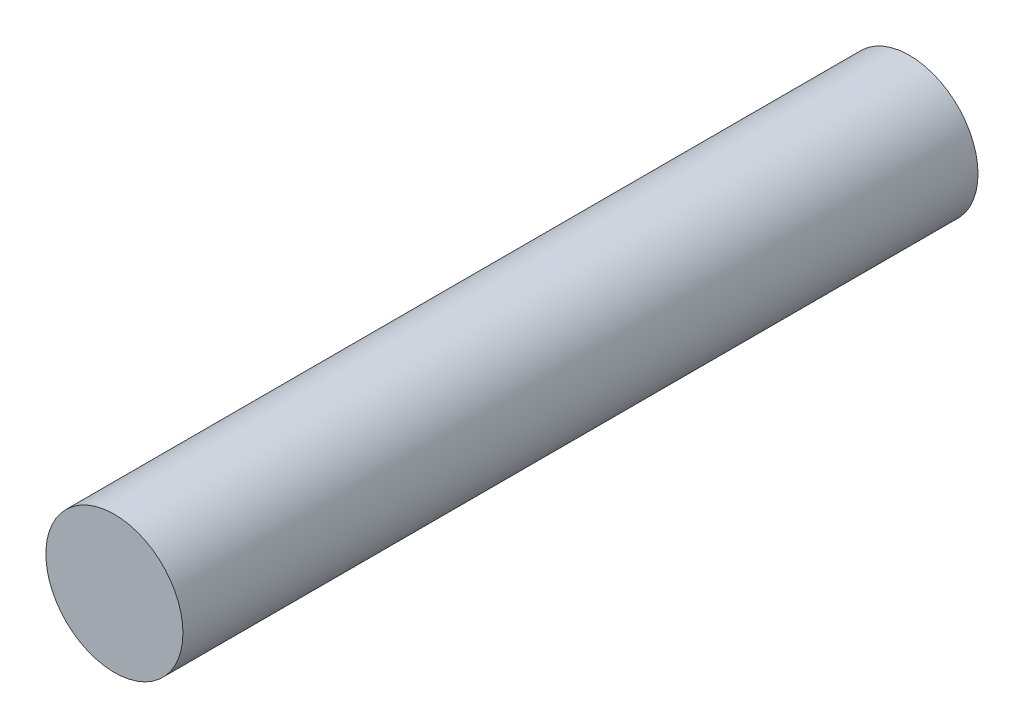
ISO-10303-21;
HEADER;
FILE_DESCRIPTION(('STEP AP214'),'2;1');
FILE_NAME('part.step','',(''),(''),'','','');
FILE_SCHEMA(('AUTOMOTIVE_DESIGN { 1 0 10303 214 1 1 1 1 }'));
ENDSEC;
DATA;
#1=APPLICATION_CONTEXT('core data for automotive mechanical design processes');
#2=APPLICATION_PROTOCOL_DEFINITION('international standard','automotive_design',2000,#1);
#3=PRODUCT_CONTEXT('',#1,'mechanical');
#4=PRODUCT('Part','Part','',(#3));
#5=PRODUCT_RELATED_PRODUCT_CATEGORY('part','',(#4));
#6=PRODUCT_DEFINITION_FORMATION('','',#4);
#7=PRODUCT_DEFINITION_CONTEXT('part definition',#1,'design');
#8=PRODUCT_DEFINITION('design','',#6,#7);
#9=PRODUCT_DEFINITION_SHAPE('','',#8);
#10=(LENGTH_UNIT() NAMED_UNIT(*) SI_UNIT(.MILLI.,.METRE.));
#11=(NAMED_UNIT(*) PLANE_ANGLE_UNIT() SI_UNIT($,.RADIAN.));
#12=(NAMED_UNIT(*) SI_UNIT($,.STERADIAN.) SOLID_ANGLE_UNIT());
#13=UNCERTAINTY_MEASURE_WITH_UNIT(LENGTH_MEASURE(1.E-05),#10,'distance_accuracy_value','');
#14=(GEOMETRIC_REPRESENTATION_CONTEXT(3) GLOBAL_UNCERTAINTY_ASSIGNED_CONTEXT((#13)) GLOBAL_UNIT_ASSIGNED_CONTEXT((#10,
#11,#12)) REPRESENTATION_CONTEXT('',''));
#15=CARTESIAN_POINT('',(0.,0.,0.));
#16=DIRECTION('',(0.,0.,1.));
#17=DIRECTION('',(1.,0.,0.));
#18=AXIS2_PLACEMENT_3D('',#15,#16,#17);
#19=CARTESIAN_POINT('',(0.,0.,36.83));
#20=DIRECTION('',(0.,0.,-1.));
#21=DIRECTION('',(-1.,0.,0.));
#22=AXIS2_PLACEMENT_3D('',#19,#20,#21);
#23=CYLINDRICAL_SURFACE('',#22,3.175);
#24=CARTESIAN_POINT('',(0.,0.,36.83));
#25=DIRECTION('',(0.,0.,1.));
#26=DIRECTION('',(1.,0.,0.));
#27=AXIS2_PLACEMENT_3D('',#24,#25,#26);
#28=CIRCLE('',#27,3.175);
#29=CARTESIAN_POINT('',(3.175,0.,36.83));
#30=VERTEX_POINT('',#29);
#31=EDGE_CURVE('E10',#30,#30,#28,.T.);
#32=ORIENTED_EDGE('',*,*,#31,.F.);
#33=EDGE_LOOP('',(#32));
#34=FACE_BOUND('',#33,.T.);
#35=CARTESIAN_POINT('',(0.,0.,0.));
#36=DIRECTION('',(0.,0.,1.));
#37=DIRECTION('',(1.,0.,0.));
#38=AXIS2_PLACEMENT_3D('',#35,#36,#37);
#39=CIRCLE('',#38,3.175);
#40=CARTESIAN_POINT('',(3.175,0.,0.));
#41=VERTEX_POINT('',#40);
#42=EDGE_CURVE('E40',#41,#41,#39,.T.);
#43=ORIENTED_EDGE('',*,*,#42,.T.);
#44=EDGE_LOOP('',(#43));
#45=FACE_BOUND('',#44,.T.);
#46=ADVANCED_FACE('F37',(#34,#45),#23,.T.);
#47=CARTESIAN_POINT('',(0.,0.,36.83));
#48=DIRECTION('',(0.,0.,1.));
#49=DIRECTION('',(1.,0.,0.));
#50=AXIS2_PLACEMENT_3D('',#47,#48,#49);
#51=PLANE('',#50);
#52=ORIENTED_EDGE('',*,*,#31,.T.);
#53=EDGE_LOOP('',(#52));
#54=FACE_BOUND('',#53,.T.);
#55=ADVANCED_FACE('F54',(#54),#51,.T.);
#56=CARTESIAN_POINT('',(0.,0.,0.));
#57=DIRECTION('',(0.,0.,1.));
#58=DIRECTION('',(1.,0.,0.));
#59=AXIS2_PLACEMENT_3D('',#56,#57,#58);
#60=PLANE('',#59);
#61=ORIENTED_EDGE('',*,*,#42,.F.);
#62=EDGE_LOOP('',(#61));
#63=FACE_BOUND('',#62,.T.);
#64=ADVANCED_FACE('F52',(#63),#60,.F.);
#65=CLOSED_SHELL('',(#46,#55,#64));
#66=MANIFOLD_SOLID_BREP('B2',#65);
#67=ADVANCED_BREP_SHAPE_REPRESENTATION('',(#18,#66),#14);
#68=SHAPE_DEFINITION_REPRESENTATION(#9,#67);
ENDSEC;
END-ISO-10303-21;
